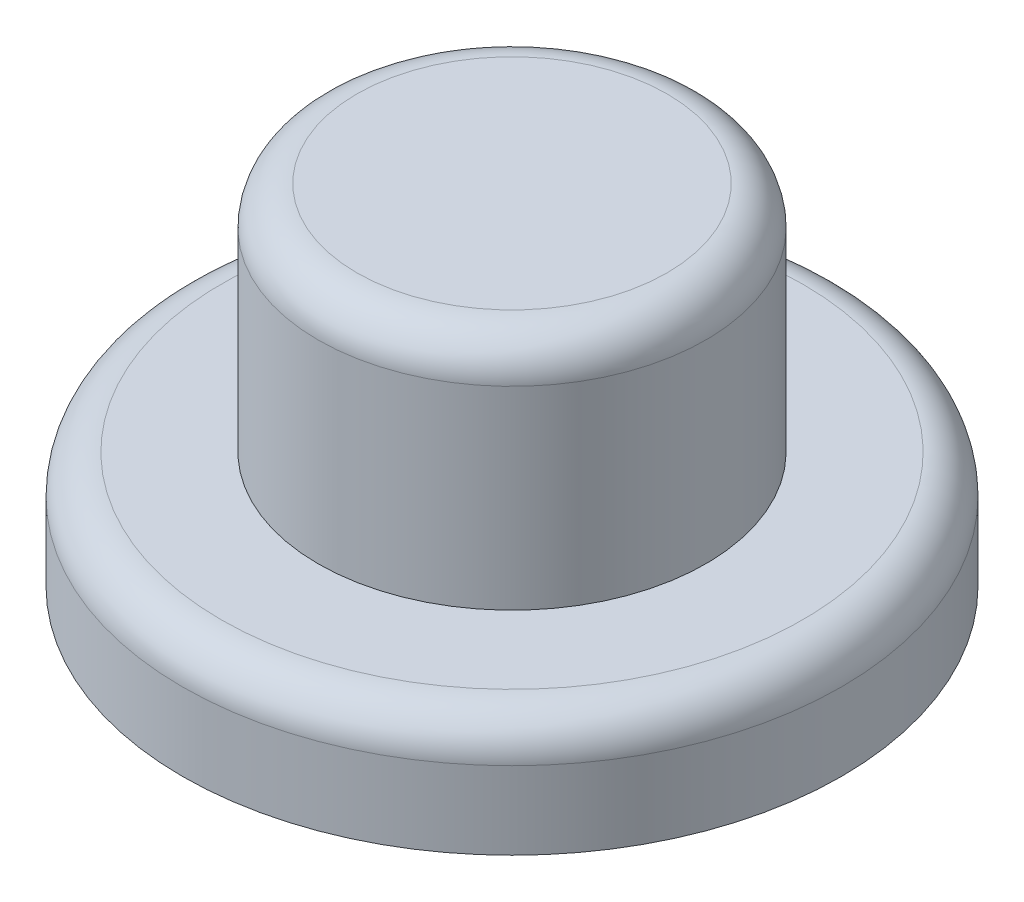
ISO-10303-21;
HEADER;
FILE_DESCRIPTION(('STEP AP214'),'2;1');
FILE_NAME('part.step','',(''),(''),'','','');
FILE_SCHEMA(('AUTOMOTIVE_DESIGN { 1 0 10303 214 1 1 1 1 }'));
ENDSEC;
DATA;
#1=APPLICATION_CONTEXT('core data for automotive mechanical design processes');
#2=APPLICATION_PROTOCOL_DEFINITION('international standard','automotive_design',2000,#1);
#3=PRODUCT_CONTEXT('',#1,'mechanical');
#4=PRODUCT('Part','Part','',(#3));
#5=PRODUCT_RELATED_PRODUCT_CATEGORY('part','',(#4));
#6=PRODUCT_DEFINITION_FORMATION('','',#4);
#7=PRODUCT_DEFINITION_CONTEXT('part definition',#1,'design');
#8=PRODUCT_DEFINITION('design','',#6,#7);
#9=PRODUCT_DEFINITION_SHAPE('','',#8);
#10=(LENGTH_UNIT() NAMED_UNIT(*) SI_UNIT(.MILLI.,.METRE.));
#11=(NAMED_UNIT(*) PLANE_ANGLE_UNIT() SI_UNIT($,.RADIAN.));
#12=(NAMED_UNIT(*) SI_UNIT($,.STERADIAN.) SOLID_ANGLE_UNIT());
#13=UNCERTAINTY_MEASURE_WITH_UNIT(LENGTH_MEASURE(1.E-05),#10,'distance_accuracy_value','');
#14=(GEOMETRIC_REPRESENTATION_CONTEXT(3) GLOBAL_UNCERTAINTY_ASSIGNED_CONTEXT((#13)) GLOBAL_UNIT_ASSIGNED_CONTEXT((#10,
#11,#12)) REPRESENTATION_CONTEXT('',''));
#15=CARTESIAN_POINT('',(0.,0.,0.));
#16=DIRECTION('',(0.,0.,1.));
#17=DIRECTION('',(1.,0.,0.));
#18=AXIS2_PLACEMENT_3D('',#15,#16,#17);
#19=CARTESIAN_POINT('',(-51.1201704164734,3.,0.));
#20=DIRECTION('',(0.,-1.,0.));
#21=DIRECTION('',(0.,0.,-1.));
#22=AXIS2_PLACEMENT_3D('',#19,#20,#21);
#23=CYLINDRICAL_SURFACE('',#22,8.5);
#24=CARTESIAN_POINT('',(-51.1201704164734,2.,0.));
#25=DIRECTION('',(0.,1.,0.));
#26=DIRECTION('',(0.,0.,1.));
#27=AXIS2_PLACEMENT_3D('',#24,#25,#26);
#28=CIRCLE('',#27,8.5);
#29=CARTESIAN_POINT('',(-51.1201704164734,2.,8.5));
#30=VERTEX_POINT('',#29);
#31=EDGE_CURVE('E50',#30,#30,#28,.F.);
#32=ORIENTED_EDGE('',*,*,#31,.T.);
#33=EDGE_LOOP('',(#32));
#34=FACE_BOUND('',#33,.T.);
#35=CARTESIAN_POINT('',(-51.1201704164734,0.,0.));
#36=DIRECTION('',(0.,1.,0.));
#37=DIRECTION('',(0.,0.,1.));
#38=AXIS2_PLACEMENT_3D('',#35,#36,#37);
#39=CIRCLE('',#38,8.5);
#40=CARTESIAN_POINT('',(-51.1201704164734,0.,8.5));
#41=VERTEX_POINT('',#40);
#42=EDGE_CURVE('E61',#41,#41,#39,.T.);
#43=ORIENTED_EDGE('',*,*,#42,.T.);
#44=EDGE_LOOP('',(#43));
#45=FACE_BOUND('',#44,.T.);
#46=ADVANCED_FACE('F37',(#34,#45),#23,.T.);
#47=CARTESIAN_POINT('',(-51.1201704164734,3.,0.));
#48=DIRECTION('',(0.,1.,0.));
#49=DIRECTION('',(0.,0.,1.));
#50=AXIS2_PLACEMENT_3D('',#47,#48,#49);
#51=PLANE('',#50);
#52=CARTESIAN_POINT('',(-51.1201704164734,3.,0.));
#53=DIRECTION('',(0.,1.,0.));
#54=DIRECTION('',(0.,0.,1.));
#55=AXIS2_PLACEMENT_3D('',#52,#53,#54);
#56=CIRCLE('',#55,5.);
#57=CARTESIAN_POINT('',(-51.1201704164734,3.,5.));
#58=VERTEX_POINT('',#57);
#59=EDGE_CURVE('E65',#58,#58,#56,.T.);
#60=ORIENTED_EDGE('',*,*,#59,.F.);
#61=EDGE_LOOP('',(#60));
#62=FACE_BOUND('',#61,.T.);
#63=CARTESIAN_POINT('',(-51.1201704164734,3.,0.));
#64=DIRECTION('',(0.,1.,0.));
#65=DIRECTION('',(0.,0.,1.));
#66=AXIS2_PLACEMENT_3D('',#63,#64,#65);
#67=CIRCLE('',#66,7.5);
#68=CARTESIAN_POINT('',(-51.1201704164734,3.,7.5));
#69=VERTEX_POINT('',#68);
#70=EDGE_CURVE('E55',#69,#69,#67,.T.);
#71=ORIENTED_EDGE('',*,*,#70,.T.);
#72=EDGE_LOOP('',(#71));
#73=FACE_BOUND('',#72,.T.);
#74=ADVANCED_FACE('F72',(#62,#73),#51,.T.);
#75=CARTESIAN_POINT('',(-51.1201704164734,0.,0.));
#76=DIRECTION('',(0.,1.,0.));
#77=DIRECTION('',(0.,0.,1.));
#78=AXIS2_PLACEMENT_3D('',#75,#76,#77);
#79=PLANE('',#78);
#80=ORIENTED_EDGE('',*,*,#42,.F.);
#81=EDGE_LOOP('',(#80));
#82=FACE_BOUND('',#81,.T.);
#83=ADVANCED_FACE('F75',(#82),#79,.F.);
#84=CARTESIAN_POINT('',(-51.1201704164734,2.,0.));
#85=DIRECTION('',(0.,1.,0.));
#86=DIRECTION('',(0.,0.,1.));
#87=AXIS2_PLACEMENT_3D('',#84,#85,#86);
#88=TOROIDAL_SURFACE('',#87,7.5,1.);
#89=ORIENTED_EDGE('',*,*,#31,.F.);
#90=EDGE_LOOP('',(#89));
#91=FACE_BOUND('',#90,.T.);
#92=ORIENTED_EDGE('',*,*,#70,.F.);
#93=EDGE_LOOP('',(#92));
#94=FACE_BOUND('',#93,.T.);
#95=ADVANCED_FACE('F79',(#91,#94),#88,.T.);
#96=CARTESIAN_POINT('',(-51.1201704164734,9.,0.));
#97=DIRECTION('',(0.,-1.,0.));
#98=DIRECTION('',(0.,0.,-1.));
#99=AXIS2_PLACEMENT_3D('',#96,#97,#98);
#100=CYLINDRICAL_SURFACE('',#99,5.);
#101=CARTESIAN_POINT('',(-51.1201704164734,8.,0.));
#102=DIRECTION('',(0.,1.,0.));
#103=DIRECTION('',(0.,0.,1.));
#104=AXIS2_PLACEMENT_3D('',#101,#102,#103);
#105=CIRCLE('',#104,5.);
#106=CARTESIAN_POINT('',(-51.1201704164734,8.,5.));
#107=VERTEX_POINT('',#106);
#108=EDGE_CURVE('E10',#107,#107,#105,.F.);
#109=ORIENTED_EDGE('',*,*,#108,.T.);
#110=EDGE_LOOP('',(#109));
#111=FACE_BOUND('',#110,.T.);
#112=ORIENTED_EDGE('',*,*,#59,.T.);
#113=EDGE_LOOP('',(#112));
#114=FACE_BOUND('',#113,.T.);
#115=ADVANCED_FACE('F70',(#111,#114),#100,.T.);
#116=CARTESIAN_POINT('',(-51.1201704164734,9.,0.));
#117=DIRECTION('',(0.,1.,0.));
#118=DIRECTION('',(0.,0.,1.));
#119=AXIS2_PLACEMENT_3D('',#116,#117,#118);
#120=PLANE('',#119);
#121=CARTESIAN_POINT('',(-51.1201704164734,9.,0.));
#122=DIRECTION('',(0.,1.,0.));
#123=DIRECTION('',(0.,0.,1.));
#124=AXIS2_PLACEMENT_3D('',#121,#122,#123);
#125=CIRCLE('',#124,4.);
#126=CARTESIAN_POINT('',(-51.1201704164734,9.,4.));
#127=VERTEX_POINT('',#126);
#128=EDGE_CURVE('E45',#127,#127,#125,.T.);
#129=ORIENTED_EDGE('',*,*,#128,.T.);
#130=EDGE_LOOP('',(#129));
#131=FACE_BOUND('',#130,.T.);
#132=ADVANCED_FACE('F86',(#131),#120,.T.);
#133=CARTESIAN_POINT('',(-51.1201704164734,8.,0.));
#134=DIRECTION('',(0.,1.,0.));
#135=DIRECTION('',(0.,0.,1.));
#136=AXIS2_PLACEMENT_3D('',#133,#134,#135);
#137=TOROIDAL_SURFACE('',#136,4.,1.);
#138=ORIENTED_EDGE('',*,*,#108,.F.);
#139=EDGE_LOOP('',(#138));
#140=FACE_BOUND('',#139,.T.);
#141=ORIENTED_EDGE('',*,*,#128,.F.);
#142=EDGE_LOOP('',(#141));
#143=FACE_BOUND('',#142,.T.);
#144=ADVANCED_FACE('F39',(#140,#143),#137,.T.);
#145=CLOSED_SHELL('',(#46,#74,#83,#95,#115,#132,#144));
#146=MANIFOLD_SOLID_BREP('B2',#145);
#147=ADVANCED_BREP_SHAPE_REPRESENTATION('',(#18,#146),#14);
#148=SHAPE_DEFINITION_REPRESENTATION(#9,#147);
ENDSEC;
END-ISO-10303-21;
